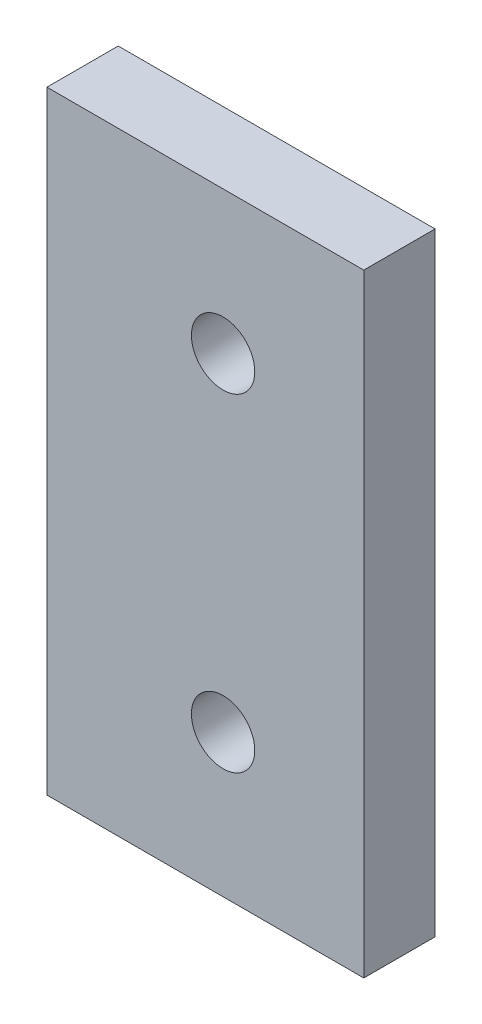
ISO-10303-21;
HEADER;
FILE_DESCRIPTION(('STEP AP214'),'2;1');
FILE_NAME('part.step','',(''),(''),'','','');
FILE_SCHEMA(('AUTOMOTIVE_DESIGN { 1 0 10303 214 1 1 1 1 }'));
ENDSEC;
DATA;
#1=APPLICATION_CONTEXT('core data for automotive mechanical design processes');
#2=APPLICATION_PROTOCOL_DEFINITION('international standard','automotive_design',2000,#1);
#3=PRODUCT_CONTEXT('',#1,'mechanical');
#4=PRODUCT('Part','Part','',(#3));
#5=PRODUCT_RELATED_PRODUCT_CATEGORY('part','',(#4));
#6=PRODUCT_DEFINITION_FORMATION('','',#4);
#7=PRODUCT_DEFINITION_CONTEXT('part definition',#1,'design');
#8=PRODUCT_DEFINITION('design','',#6,#7);
#9=PRODUCT_DEFINITION_SHAPE('','',#8);
#10=(LENGTH_UNIT() NAMED_UNIT(*) SI_UNIT(.MILLI.,.METRE.));
#11=(NAMED_UNIT(*) PLANE_ANGLE_UNIT() SI_UNIT($,.RADIAN.));
#12=(NAMED_UNIT(*) SI_UNIT($,.STERADIAN.) SOLID_ANGLE_UNIT());
#13=UNCERTAINTY_MEASURE_WITH_UNIT(LENGTH_MEASURE(1.E-05),#10,'distance_accuracy_value','');
#14=(GEOMETRIC_REPRESENTATION_CONTEXT(3) GLOBAL_UNCERTAINTY_ASSIGNED_CONTEXT((#13)) GLOBAL_UNIT_ASSIGNED_CONTEXT((#10,
#11,#12)) REPRESENTATION_CONTEXT('',''));
#15=CARTESIAN_POINT('',(0.,0.,0.));
#16=DIRECTION('',(0.,0.,1.));
#17=DIRECTION('',(1.,0.,0.));
#18=AXIS2_PLACEMENT_3D('',#15,#16,#17);
#19=CARTESIAN_POINT('',(-11.118299999991,0.,4.5));
#20=DIRECTION('',(-1.,0.,0.));
#21=DIRECTION('',(0.,-1.,0.));
#22=AXIS2_PLACEMENT_3D('',#19,#20,#21);
#23=PLANE('',#22);
#24=DIRECTION('',(0.,1.,0.));
#25=VECTOR('',#24,1.);
#26=CARTESIAN_POINT('',(-11.118299999991,0.,0.));
#27=LINE('',#26,#25);
#28=CARTESIAN_POINT('',(-11.118299999991,-9.00000000000006,0.));
#29=VERTEX_POINT('',#28);
#30=CARTESIAN_POINT('',(-11.118299999991,29.7000000000001,0.));
#31=VERTEX_POINT('',#30);
#32=EDGE_CURVE('E107',#29,#31,#27,.T.);
#33=ORIENTED_EDGE('',*,*,#32,.F.);
#34=DIRECTION('',(0.,0.,-1.));
#35=VECTOR('',#34,1.);
#36=CARTESIAN_POINT('',(-11.118299999991,-9.00000000000006,4.5));
#37=LINE('',#36,#35);
#38=CARTESIAN_POINT('',(-11.118299999991,-9.00000000000006,4.5));
#39=VERTEX_POINT('',#38);
#40=EDGE_CURVE('E11',#39,#29,#37,.T.);
#41=ORIENTED_EDGE('',*,*,#40,.F.);
#42=DIRECTION('',(0.,1.,0.));
#43=VECTOR('',#42,1.);
#44=CARTESIAN_POINT('',(-11.118299999991,0.,4.5));
#45=LINE('',#44,#43);
#46=CARTESIAN_POINT('',(-11.118299999991,29.7000000000001,4.5));
#47=VERTEX_POINT('',#46);
#48=EDGE_CURVE('E91',#39,#47,#45,.T.);
#49=ORIENTED_EDGE('',*,*,#48,.T.);
#50=DIRECTION('',(0.,0.,-1.));
#51=VECTOR('',#50,1.);
#52=CARTESIAN_POINT('',(-11.118299999991,29.7000000000001,4.5));
#53=LINE('',#52,#51);
#54=EDGE_CURVE('E53',#47,#31,#53,.T.);
#55=ORIENTED_EDGE('',*,*,#54,.T.);
#56=EDGE_LOOP('',(#33,#41,#49,#55));
#57=FACE_BOUND('',#56,.T.);
#58=ADVANCED_FACE('F36',(#57),#23,.T.);
#59=CARTESIAN_POINT('',(0.,-9.00000000000006,4.5));
#60=DIRECTION('',(0.,1.,0.));
#61=DIRECTION('',(-1.,0.,0.));
#62=AXIS2_PLACEMENT_3D('',#59,#60,#61);
#63=PLANE('',#62);
#64=DIRECTION('',(1.,0.,0.));
#65=VECTOR('',#64,1.);
#66=CARTESIAN_POINT('',(0.,-9.00000000000006,0.));
#67=LINE('',#66,#65);
#68=CARTESIAN_POINT('',(8.88169999999967,-9.00000000000007,0.));
#69=VERTEX_POINT('',#68);
#70=EDGE_CURVE('E96',#29,#69,#67,.T.);
#71=ORIENTED_EDGE('',*,*,#70,.T.);
#72=DIRECTION('',(0.,0.,-1.));
#73=VECTOR('',#72,1.);
#74=CARTESIAN_POINT('',(8.88169999999967,-9.00000000000007,4.5));
#75=LINE('',#74,#73);
#76=CARTESIAN_POINT('',(8.88169999999967,-9.00000000000007,4.5));
#77=VERTEX_POINT('',#76);
#78=EDGE_CURVE('E45',#77,#69,#75,.T.);
#79=ORIENTED_EDGE('',*,*,#78,.F.);
#80=DIRECTION('',(1.,0.,0.));
#81=VECTOR('',#80,1.);
#82=CARTESIAN_POINT('',(0.,-9.00000000000006,4.5));
#83=LINE('',#82,#81);
#84=EDGE_CURVE('E87',#39,#77,#83,.T.);
#85=ORIENTED_EDGE('',*,*,#84,.F.);
#86=ORIENTED_EDGE('',*,*,#40,.T.);
#87=EDGE_LOOP('',(#71,#79,#85,#86));
#88=FACE_BOUND('',#87,.T.);
#89=ADVANCED_FACE('F94',(#88),#63,.F.);
#90=CARTESIAN_POINT('',(8.88169999999966,0.,4.5));
#91=DIRECTION('',(-1.,0.,0.));
#92=DIRECTION('',(0.,-1.,0.));
#93=AXIS2_PLACEMENT_3D('',#90,#91,#92);
#94=PLANE('',#93);
#95=DIRECTION('',(0.,1.,0.));
#96=VECTOR('',#95,1.);
#97=CARTESIAN_POINT('',(8.88169999999966,0.,0.));
#98=LINE('',#97,#96);
#99=CARTESIAN_POINT('',(8.88169999999966,29.7000000000001,0.));
#100=VERTEX_POINT('',#99);
#101=EDGE_CURVE('E104',#69,#100,#98,.T.);
#102=ORIENTED_EDGE('',*,*,#101,.T.);
#103=DIRECTION('',(0.,0.,-1.));
#104=VECTOR('',#103,1.);
#105=CARTESIAN_POINT('',(8.88169999999966,29.7000000000001,4.5));
#106=LINE('',#105,#104);
#107=CARTESIAN_POINT('',(8.88169999999966,29.7000000000001,4.5));
#108=VERTEX_POINT('',#107);
#109=EDGE_CURVE('E67',#108,#100,#106,.T.);
#110=ORIENTED_EDGE('',*,*,#109,.F.);
#111=DIRECTION('',(0.,1.,0.));
#112=VECTOR('',#111,1.);
#113=CARTESIAN_POINT('',(8.88169999999966,0.,4.5));
#114=LINE('',#113,#112);
#115=EDGE_CURVE('E79',#77,#108,#114,.T.);
#116=ORIENTED_EDGE('',*,*,#115,.F.);
#117=ORIENTED_EDGE('',*,*,#78,.T.);
#118=EDGE_LOOP('',(#102,#110,#116,#117));
#119=FACE_BOUND('',#118,.T.);
#120=ADVANCED_FACE('F81',(#119),#94,.F.);
#121=CARTESIAN_POINT('',(0.,0.,4.5));
#122=DIRECTION('',(0.,0.,-1.));
#123=DIRECTION('',(-1.,0.,0.));
#124=AXIS2_PLACEMENT_3D('',#121,#122,#123);
#125=CYLINDRICAL_SURFACE('',#124,2.);
#126=CARTESIAN_POINT('',(0.,0.,4.5));
#127=DIRECTION('',(0.,0.,1.));
#128=DIRECTION('',(1.,0.,0.));
#129=AXIS2_PLACEMENT_3D('',#126,#127,#128);
#130=CIRCLE('',#129,2.);
#131=CARTESIAN_POINT('',(2.,0.,4.5));
#132=VERTEX_POINT('',#131);
#133=EDGE_CURVE('E117',#132,#132,#130,.T.);
#134=ORIENTED_EDGE('',*,*,#133,.T.);
#135=EDGE_LOOP('',(#134));
#136=FACE_BOUND('',#135,.T.);
#137=CARTESIAN_POINT('',(0.,0.,0.));
#138=DIRECTION('',(0.,0.,1.));
#139=DIRECTION('',(1.,0.,0.));
#140=AXIS2_PLACEMENT_3D('',#137,#138,#139);
#141=CIRCLE('',#140,2.);
#142=CARTESIAN_POINT('',(2.,0.,0.));
#143=VERTEX_POINT('',#142);
#144=EDGE_CURVE('E109',#143,#143,#141,.T.);
#145=ORIENTED_EDGE('',*,*,#144,.F.);
#146=EDGE_LOOP('',(#145));
#147=FACE_BOUND('',#146,.T.);
#148=ADVANCED_FACE('F132',(#136,#147),#125,.F.);
#149=CARTESIAN_POINT('',(0.,20.7,4.5));
#150=DIRECTION('',(0.,0.,-1.));
#151=DIRECTION('',(-1.,0.,0.));
#152=AXIS2_PLACEMENT_3D('',#149,#150,#151);
#153=CYLINDRICAL_SURFACE('',#152,2.);
#154=CARTESIAN_POINT('',(0.,20.7,4.5));
#155=DIRECTION('',(0.,0.,1.));
#156=DIRECTION('',(1.,0.,0.));
#157=AXIS2_PLACEMENT_3D('',#154,#155,#156);
#158=CIRCLE('',#157,2.);
#159=CARTESIAN_POINT('',(2.00000000000004,20.7,4.5));
#160=VERTEX_POINT('',#159);
#161=EDGE_CURVE('E103',#160,#160,#158,.T.);
#162=ORIENTED_EDGE('',*,*,#161,.T.);
#163=EDGE_LOOP('',(#162));
#164=FACE_BOUND('',#163,.T.);
#165=CARTESIAN_POINT('',(0.,20.7,0.));
#166=DIRECTION('',(0.,0.,1.));
#167=DIRECTION('',(1.,0.,0.));
#168=AXIS2_PLACEMENT_3D('',#165,#166,#167);
#169=CIRCLE('',#168,2.);
#170=CARTESIAN_POINT('',(2.00000000000004,20.7,0.));
#171=VERTEX_POINT('',#170);
#172=EDGE_CURVE('E112',#171,#171,#169,.T.);
#173=ORIENTED_EDGE('',*,*,#172,.F.);
#174=EDGE_LOOP('',(#173));
#175=FACE_BOUND('',#174,.T.);
#176=ADVANCED_FACE('F38',(#164,#175),#153,.F.);
#177=CARTESIAN_POINT('',(0.,29.7000000000001,4.5));
#178=DIRECTION('',(0.,1.,0.));
#179=DIRECTION('',(0.,0.,1.));
#180=AXIS2_PLACEMENT_3D('',#177,#178,#179);
#181=PLANE('',#180);
#182=DIRECTION('',(1.,0.,0.));
#183=VECTOR('',#182,1.);
#184=CARTESIAN_POINT('',(0.,29.7000000000001,0.));
#185=LINE('',#184,#183);
#186=EDGE_CURVE('E100',#31,#100,#185,.T.);
#187=ORIENTED_EDGE('',*,*,#186,.F.);
#188=ORIENTED_EDGE('',*,*,#54,.F.);
#189=DIRECTION('',(1.,0.,0.));
#190=VECTOR('',#189,1.);
#191=CARTESIAN_POINT('',(0.,29.7000000000001,4.5));
#192=LINE('',#191,#190);
#193=EDGE_CURVE('E86',#47,#108,#192,.T.);
#194=ORIENTED_EDGE('',*,*,#193,.T.);
#195=ORIENTED_EDGE('',*,*,#109,.T.);
#196=EDGE_LOOP('',(#187,#188,#194,#195));
#197=FACE_BOUND('',#196,.T.);
#198=ADVANCED_FACE('F128',(#197),#181,.T.);
#199=CARTESIAN_POINT('',(0.,0.,4.5));
#200=DIRECTION('',(0.,0.,1.));
#201=DIRECTION('',(1.,0.,0.));
#202=AXIS2_PLACEMENT_3D('',#199,#200,#201);
#203=PLANE('',#202);
#204=ORIENTED_EDGE('',*,*,#161,.F.);
#205=EDGE_LOOP('',(#204));
#206=FACE_BOUND('',#205,.T.);
#207=ORIENTED_EDGE('',*,*,#133,.F.);
#208=EDGE_LOOP('',(#207));
#209=FACE_BOUND('',#208,.T.);
#210=ORIENTED_EDGE('',*,*,#48,.F.);
#211=ORIENTED_EDGE('',*,*,#84,.T.);
#212=ORIENTED_EDGE('',*,*,#115,.T.);
#213=ORIENTED_EDGE('',*,*,#193,.F.);
#214=EDGE_LOOP('',(#210,#211,#212,#213));
#215=FACE_BOUND('',#214,.T.);
#216=ADVANCED_FACE('F90',(#206,#209,#215),#203,.T.);
#217=CARTESIAN_POINT('',(0.,0.,0.));
#218=DIRECTION('',(0.,0.,1.));
#219=DIRECTION('',(1.,0.,0.));
#220=AXIS2_PLACEMENT_3D('',#217,#218,#219);
#221=PLANE('',#220);
#222=ORIENTED_EDGE('',*,*,#172,.T.);
#223=EDGE_LOOP('',(#222));
#224=FACE_BOUND('',#223,.T.);
#225=ORIENTED_EDGE('',*,*,#144,.T.);
#226=EDGE_LOOP('',(#225));
#227=FACE_BOUND('',#226,.T.);
#228=ORIENTED_EDGE('',*,*,#32,.T.);
#229=ORIENTED_EDGE('',*,*,#186,.T.);
#230=ORIENTED_EDGE('',*,*,#101,.F.);
#231=ORIENTED_EDGE('',*,*,#70,.F.);
#232=EDGE_LOOP('',(#228,#229,#230,#231));
#233=FACE_BOUND('',#232,.T.);
#234=ADVANCED_FACE('F127',(#224,#227,#233),#221,.F.);
#235=CLOSED_SHELL('',(#58,#89,#120,#148,#176,#198,#216,#234));
#236=MANIFOLD_SOLID_BREP('B2',#235);
#237=ADVANCED_BREP_SHAPE_REPRESENTATION('',(#18,#236),#14);
#238=SHAPE_DEFINITION_REPRESENTATION(#9,#237);
ENDSEC;
END-ISO-10303-21;
